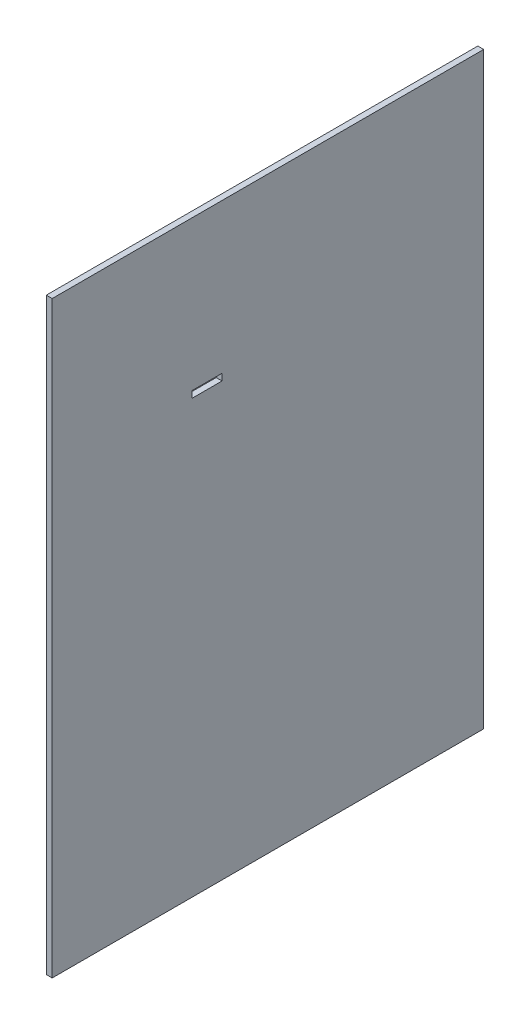
ISO-10303-21;
HEADER;
FILE_DESCRIPTION(('STEP AP214'),'2;1');
FILE_NAME('part.step','',(''),(''),'','','');
FILE_SCHEMA(('AUTOMOTIVE_DESIGN { 1 0 10303 214 1 1 1 1 }'));
ENDSEC;
DATA;
#1=APPLICATION_CONTEXT('core data for automotive mechanical design processes');
#2=APPLICATION_PROTOCOL_DEFINITION('international standard','automotive_design',2000,#1);
#3=PRODUCT_CONTEXT('',#1,'mechanical');
#4=PRODUCT('Part','Part','',(#3));
#5=PRODUCT_RELATED_PRODUCT_CATEGORY('part','',(#4));
#6=PRODUCT_DEFINITION_FORMATION('','',#4);
#7=PRODUCT_DEFINITION_CONTEXT('part definition',#1,'design');
#8=PRODUCT_DEFINITION('design','',#6,#7);
#9=PRODUCT_DEFINITION_SHAPE('','',#8);
#10=(LENGTH_UNIT() NAMED_UNIT(*) SI_UNIT(.MILLI.,.METRE.));
#11=(NAMED_UNIT(*) PLANE_ANGLE_UNIT() SI_UNIT($,.RADIAN.));
#12=(NAMED_UNIT(*) SI_UNIT($,.STERADIAN.) SOLID_ANGLE_UNIT());
#13=UNCERTAINTY_MEASURE_WITH_UNIT(LENGTH_MEASURE(1.E-05),#10,'distance_accuracy_value','');
#14=(GEOMETRIC_REPRESENTATION_CONTEXT(3) GLOBAL_UNCERTAINTY_ASSIGNED_CONTEXT((#13)) GLOBAL_UNIT_ASSIGNED_CONTEXT((#10,
#11,#12)) REPRESENTATION_CONTEXT('',''));
#15=CARTESIAN_POINT('',(0.,0.,0.));
#16=DIRECTION('',(0.,0.,1.));
#17=DIRECTION('',(1.,0.,0.));
#18=AXIS2_PLACEMENT_3D('',#15,#16,#17);
#19=CARTESIAN_POINT('',(1.5,0.,0.));
#20=DIRECTION('',(-1.,0.,0.));
#21=DIRECTION('',(0.,0.,1.));
#22=AXIS2_PLACEMENT_3D('',#19,#20,#21);
#23=PLANE('',#22);
#24=DIRECTION('',(0.,-1.,0.));
#25=VECTOR('',#24,1.);
#26=CARTESIAN_POINT('',(1.5,0.,0.));
#27=LINE('',#26,#25);
#28=CARTESIAN_POINT('',(1.5,150.,0.));
#29=VERTEX_POINT('',#28);
#30=CARTESIAN_POINT('',(1.5,0.,0.));
#31=VERTEX_POINT('',#30);
#32=EDGE_CURVE('E134',#29,#31,#27,.T.);
#33=ORIENTED_EDGE('',*,*,#32,.T.);
#34=DIRECTION('',(0.,0.,-1.));
#35=VECTOR('',#34,1.);
#36=CARTESIAN_POINT('',(1.5,0.,0.));
#37=LINE('',#36,#35);
#38=CARTESIAN_POINT('',(1.5,0.,-110.));
#39=VERTEX_POINT('',#38);
#40=EDGE_CURVE('E137',#31,#39,#37,.T.);
#41=ORIENTED_EDGE('',*,*,#40,.T.);
#42=DIRECTION('',(0.,1.,0.));
#43=VECTOR('',#42,1.);
#44=CARTESIAN_POINT('',(1.5,0.,-110.));
#45=LINE('',#44,#43);
#46=CARTESIAN_POINT('',(1.5,150.,-110.));
#47=VERTEX_POINT('',#46);
#48=EDGE_CURVE('E140',#39,#47,#45,.T.);
#49=ORIENTED_EDGE('',*,*,#48,.T.);
#50=DIRECTION('',(0.,0.,1.));
#51=VECTOR('',#50,1.);
#52=CARTESIAN_POINT('',(1.5,150.,0.));
#53=LINE('',#52,#51);
#54=EDGE_CURVE('E142',#47,#29,#53,.T.);
#55=ORIENTED_EDGE('',*,*,#54,.T.);
#56=EDGE_LOOP('',(#33,#41,#49,#55));
#57=FACE_BOUND('',#56,.T.);
#58=DIRECTION('',(0.,1.,0.));
#59=VECTOR('',#58,1.);
#60=CARTESIAN_POINT('',(1.5,110.151202360728,-43.3061214330925));
#61=LINE('',#60,#59);
#62=CARTESIAN_POINT('',(1.5,110.151202360728,-43.3061214330925));
#63=VERTEX_POINT('',#62);
#64=CARTESIAN_POINT('',(1.5,111.850357660158,-43.3061214330925));
#65=VERTEX_POINT('',#64);
#66=EDGE_CURVE('E98',#63,#65,#61,.T.);
#67=ORIENTED_EDGE('',*,*,#66,.F.);
#68=DIRECTION('',(0.,0.,-1.));
#69=VECTOR('',#68,1.);
#70=CARTESIAN_POINT('',(1.5,110.151202360728,-35.6061214330926));
#71=LINE('',#70,#69);
#72=CARTESIAN_POINT('',(1.5,110.151202360728,-35.6061214330926));
#73=VERTEX_POINT('',#72);
#74=EDGE_CURVE('E120',#73,#63,#71,.T.);
#75=ORIENTED_EDGE('',*,*,#74,.F.);
#76=DIRECTION('',(0.,-1.,0.));
#77=VECTOR('',#76,1.);
#78=CARTESIAN_POINT('',(1.5,110.151202360728,-35.6061214330926));
#79=LINE('',#78,#77);
#80=CARTESIAN_POINT('',(1.5,111.850357660158,-35.6061214330926));
#81=VERTEX_POINT('',#80);
#82=EDGE_CURVE('E118',#81,#73,#79,.T.);
#83=ORIENTED_EDGE('',*,*,#82,.F.);
#84=DIRECTION('',(0.,0.,1.));
#85=VECTOR('',#84,1.);
#86=CARTESIAN_POINT('',(1.5,111.850357660158,-35.6061214330926));
#87=LINE('',#86,#85);
#88=EDGE_CURVE('E106',#65,#81,#87,.T.);
#89=ORIENTED_EDGE('',*,*,#88,.F.);
#90=EDGE_LOOP('',(#67,#75,#83,#89));
#91=FACE_BOUND('',#90,.T.);
#92=ADVANCED_FACE('F33',(#57,#91),#23,.F.);
#93=CARTESIAN_POINT('',(0.,0.,0.));
#94=DIRECTION('',(-1.,0.,0.));
#95=DIRECTION('',(0.,0.,1.));
#96=AXIS2_PLACEMENT_3D('',#93,#94,#95);
#97=PLANE('',#96);
#98=DIRECTION('',(0.,-1.,0.));
#99=VECTOR('',#98,1.);
#100=CARTESIAN_POINT('',(0.,0.,0.));
#101=LINE('',#100,#99);
#102=CARTESIAN_POINT('',(0.,150.,0.));
#103=VERTEX_POINT('',#102);
#104=CARTESIAN_POINT('',(0.,0.,0.));
#105=VERTEX_POINT('',#104);
#106=EDGE_CURVE('E114',#103,#105,#101,.T.);
#107=ORIENTED_EDGE('',*,*,#106,.F.);
#108=DIRECTION('',(0.,0.,1.));
#109=VECTOR('',#108,1.);
#110=CARTESIAN_POINT('',(0.,150.,0.));
#111=LINE('',#110,#109);
#112=CARTESIAN_POINT('',(0.,150.,-110.));
#113=VERTEX_POINT('',#112);
#114=EDGE_CURVE('E138',#113,#103,#111,.T.);
#115=ORIENTED_EDGE('',*,*,#114,.F.);
#116=DIRECTION('',(0.,1.,0.));
#117=VECTOR('',#116,1.);
#118=CARTESIAN_POINT('',(0.,0.,-110.));
#119=LINE('',#118,#117);
#120=CARTESIAN_POINT('',(0.,0.,-110.));
#121=VERTEX_POINT('',#120);
#122=EDGE_CURVE('E149',#121,#113,#119,.T.);
#123=ORIENTED_EDGE('',*,*,#122,.F.);
#124=DIRECTION('',(0.,0.,-1.));
#125=VECTOR('',#124,1.);
#126=CARTESIAN_POINT('',(0.,0.,0.));
#127=LINE('',#126,#125);
#128=EDGE_CURVE('E147',#105,#121,#127,.T.);
#129=ORIENTED_EDGE('',*,*,#128,.F.);
#130=EDGE_LOOP('',(#107,#115,#123,#129));
#131=FACE_BOUND('',#130,.T.);
#132=DIRECTION('',(0.,0.,-1.));
#133=VECTOR('',#132,1.);
#134=CARTESIAN_POINT('',(0.,110.151202360728,-35.6061214330926));
#135=LINE('',#134,#133);
#136=CARTESIAN_POINT('',(0.,110.151202360728,-35.6061214330926));
#137=VERTEX_POINT('',#136);
#138=CARTESIAN_POINT('',(0.,110.151202360728,-43.3061214330925));
#139=VERTEX_POINT('',#138);
#140=EDGE_CURVE('E107',#137,#139,#135,.T.);
#141=ORIENTED_EDGE('',*,*,#140,.T.);
#142=DIRECTION('',(0.,1.,0.));
#143=VECTOR('',#142,1.);
#144=CARTESIAN_POINT('',(0.,110.151202360728,-43.3061214330925));
#145=LINE('',#144,#143);
#146=CARTESIAN_POINT('',(0.,111.850357660158,-43.3061214330925));
#147=VERTEX_POINT('',#146);
#148=EDGE_CURVE('E56',#139,#147,#145,.T.);
#149=ORIENTED_EDGE('',*,*,#148,.T.);
#150=DIRECTION('',(0.,0.,1.));
#151=VECTOR('',#150,1.);
#152=CARTESIAN_POINT('',(0.,111.850357660158,-35.6061214330926));
#153=LINE('',#152,#151);
#154=CARTESIAN_POINT('',(0.,111.850357660158,-35.6061214330926));
#155=VERTEX_POINT('',#154);
#156=EDGE_CURVE('E113',#147,#155,#153,.T.);
#157=ORIENTED_EDGE('',*,*,#156,.T.);
#158=DIRECTION('',(0.,-1.,0.));
#159=VECTOR('',#158,1.);
#160=CARTESIAN_POINT('',(0.,110.151202360728,-35.6061214330926));
#161=LINE('',#160,#159);
#162=EDGE_CURVE('E126',#155,#137,#161,.T.);
#163=ORIENTED_EDGE('',*,*,#162,.T.);
#164=EDGE_LOOP('',(#141,#149,#157,#163));
#165=FACE_BOUND('',#164,.T.);
#166=ADVANCED_FACE('F167',(#131,#165),#97,.T.);
#167=CARTESIAN_POINT('',(1.5,0.,0.));
#168=DIRECTION('',(0.,0.,-1.));
#169=DIRECTION('',(0.,1.,0.));
#170=AXIS2_PLACEMENT_3D('',#167,#168,#169);
#171=PLANE('',#170);
#172=ORIENTED_EDGE('',*,*,#106,.T.);
#173=DIRECTION('',(-1.,0.,0.));
#174=VECTOR('',#173,1.);
#175=CARTESIAN_POINT('',(1.5,0.,0.));
#176=LINE('',#175,#174);
#177=EDGE_CURVE('E11',#31,#105,#176,.T.);
#178=ORIENTED_EDGE('',*,*,#177,.F.);
#179=ORIENTED_EDGE('',*,*,#32,.F.);
#180=DIRECTION('',(-1.,0.,0.));
#181=VECTOR('',#180,1.);
#182=CARTESIAN_POINT('',(1.5,150.,0.));
#183=LINE('',#182,#181);
#184=EDGE_CURVE('E144',#29,#103,#183,.T.);
#185=ORIENTED_EDGE('',*,*,#184,.T.);
#186=EDGE_LOOP('',(#172,#178,#179,#185));
#187=FACE_BOUND('',#186,.T.);
#188=ADVANCED_FACE('F35',(#187),#171,.F.);
#189=CARTESIAN_POINT('',(1.5,0.,0.));
#190=DIRECTION('',(0.,1.,0.));
#191=DIRECTION('',(0.,0.,1.));
#192=AXIS2_PLACEMENT_3D('',#189,#190,#191);
#193=PLANE('',#192);
#194=ORIENTED_EDGE('',*,*,#128,.T.);
#195=DIRECTION('',(-1.,0.,0.));
#196=VECTOR('',#195,1.);
#197=CARTESIAN_POINT('',(1.5,0.,-110.));
#198=LINE('',#197,#196);
#199=EDGE_CURVE('E41',#39,#121,#198,.T.);
#200=ORIENTED_EDGE('',*,*,#199,.F.);
#201=ORIENTED_EDGE('',*,*,#40,.F.);
#202=ORIENTED_EDGE('',*,*,#177,.T.);
#203=EDGE_LOOP('',(#194,#200,#201,#202));
#204=FACE_BOUND('',#203,.T.);
#205=ADVANCED_FACE('F177',(#204),#193,.F.);
#206=CARTESIAN_POINT('',(1.5,0.,-110.));
#207=DIRECTION('',(0.,0.,1.));
#208=DIRECTION('',(0.,-1.,0.));
#209=AXIS2_PLACEMENT_3D('',#206,#207,#208);
#210=PLANE('',#209);
#211=ORIENTED_EDGE('',*,*,#122,.T.);
#212=DIRECTION('',(-1.,0.,0.));
#213=VECTOR('',#212,1.);
#214=CARTESIAN_POINT('',(1.5,150.,-110.));
#215=LINE('',#214,#213);
#216=EDGE_CURVE('E154',#47,#113,#215,.T.);
#217=ORIENTED_EDGE('',*,*,#216,.F.);
#218=ORIENTED_EDGE('',*,*,#48,.F.);
#219=ORIENTED_EDGE('',*,*,#199,.T.);
#220=EDGE_LOOP('',(#211,#217,#218,#219));
#221=FACE_BOUND('',#220,.T.);
#222=ADVANCED_FACE('F161',(#221),#210,.F.);
#223=CARTESIAN_POINT('',(1.5,150.,0.));
#224=DIRECTION('',(0.,-1.,0.));
#225=DIRECTION('',(0.,0.,-1.));
#226=AXIS2_PLACEMENT_3D('',#223,#224,#225);
#227=PLANE('',#226);
#228=ORIENTED_EDGE('',*,*,#114,.T.);
#229=ORIENTED_EDGE('',*,*,#184,.F.);
#230=ORIENTED_EDGE('',*,*,#54,.F.);
#231=ORIENTED_EDGE('',*,*,#216,.T.);
#232=EDGE_LOOP('',(#228,#229,#230,#231));
#233=FACE_BOUND('',#232,.T.);
#234=ADVANCED_FACE('F171',(#233),#227,.F.);
#235=CARTESIAN_POINT('',(1.5,110.151202360728,-43.3061214330925));
#236=DIRECTION('',(0.,0.,1.));
#237=DIRECTION('',(1.,0.,0.));
#238=AXIS2_PLACEMENT_3D('',#235,#236,#237);
#239=PLANE('',#238);
#240=ORIENTED_EDGE('',*,*,#148,.F.);
#241=DIRECTION('',(-1.,0.,0.));
#242=VECTOR('',#241,1.);
#243=CARTESIAN_POINT('',(1.5,110.151202360728,-43.3061214330925));
#244=LINE('',#243,#242);
#245=EDGE_CURVE('E102',#63,#139,#244,.T.);
#246=ORIENTED_EDGE('',*,*,#245,.F.);
#247=ORIENTED_EDGE('',*,*,#66,.T.);
#248=DIRECTION('',(-1.,0.,0.));
#249=VECTOR('',#248,1.);
#250=CARTESIAN_POINT('',(1.5,111.850357660158,-43.3061214330925));
#251=LINE('',#250,#249);
#252=EDGE_CURVE('E101',#65,#147,#251,.T.);
#253=ORIENTED_EDGE('',*,*,#252,.T.);
#254=EDGE_LOOP('',(#240,#246,#247,#253));
#255=FACE_BOUND('',#254,.T.);
#256=ADVANCED_FACE('F100',(#255),#239,.T.);
#257=CARTESIAN_POINT('',(1.5,111.850357660158,-35.6061214330926));
#258=DIRECTION('',(0.,-1.,0.));
#259=DIRECTION('',(0.,0.,-1.));
#260=AXIS2_PLACEMENT_3D('',#257,#258,#259);
#261=PLANE('',#260);
#262=ORIENTED_EDGE('',*,*,#156,.F.);
#263=ORIENTED_EDGE('',*,*,#252,.F.);
#264=ORIENTED_EDGE('',*,*,#88,.T.);
#265=DIRECTION('',(-1.,0.,0.));
#266=VECTOR('',#265,1.);
#267=CARTESIAN_POINT('',(1.5,111.850357660158,-35.6061214330926));
#268=LINE('',#267,#266);
#269=EDGE_CURVE('E115',#81,#155,#268,.T.);
#270=ORIENTED_EDGE('',*,*,#269,.T.);
#271=EDGE_LOOP('',(#262,#263,#264,#270));
#272=FACE_BOUND('',#271,.T.);
#273=ADVANCED_FACE('F110',(#272),#261,.T.);
#274=CARTESIAN_POINT('',(1.5,110.151202360728,-35.6061214330926));
#275=DIRECTION('',(0.,0.,-1.));
#276=DIRECTION('',(-1.,0.,0.));
#277=AXIS2_PLACEMENT_3D('',#274,#275,#276);
#278=PLANE('',#277);
#279=ORIENTED_EDGE('',*,*,#162,.F.);
#280=ORIENTED_EDGE('',*,*,#269,.F.);
#281=ORIENTED_EDGE('',*,*,#82,.T.);
#282=DIRECTION('',(-1.,0.,0.));
#283=VECTOR('',#282,1.);
#284=CARTESIAN_POINT('',(1.5,110.151202360728,-35.6061214330926));
#285=LINE('',#284,#283);
#286=EDGE_CURVE('E48',#73,#137,#285,.T.);
#287=ORIENTED_EDGE('',*,*,#286,.T.);
#288=EDGE_LOOP('',(#279,#280,#281,#287));
#289=FACE_BOUND('',#288,.T.);
#290=ADVANCED_FACE('F200',(#289),#278,.T.);
#291=CARTESIAN_POINT('',(1.5,110.151202360728,-35.6061214330926));
#292=DIRECTION('',(0.,1.,0.));
#293=DIRECTION('',(0.,0.,1.));
#294=AXIS2_PLACEMENT_3D('',#291,#292,#293);
#295=PLANE('',#294);
#296=ORIENTED_EDGE('',*,*,#140,.F.);
#297=ORIENTED_EDGE('',*,*,#286,.F.);
#298=ORIENTED_EDGE('',*,*,#74,.T.);
#299=ORIENTED_EDGE('',*,*,#245,.T.);
#300=EDGE_LOOP('',(#296,#297,#298,#299));
#301=FACE_BOUND('',#300,.T.);
#302=ADVANCED_FACE('F204',(#301),#295,.T.);
#303=CLOSED_SHELL('',(#92,#166,#188,#205,#222,#234,#256,#273,#290,#302));
#304=MANIFOLD_SOLID_BREP('B2',#303);
#305=ADVANCED_BREP_SHAPE_REPRESENTATION('',(#18,#304),#14);
#306=SHAPE_DEFINITION_REPRESENTATION(#9,#305);
ENDSEC;
END-ISO-10303-21;
